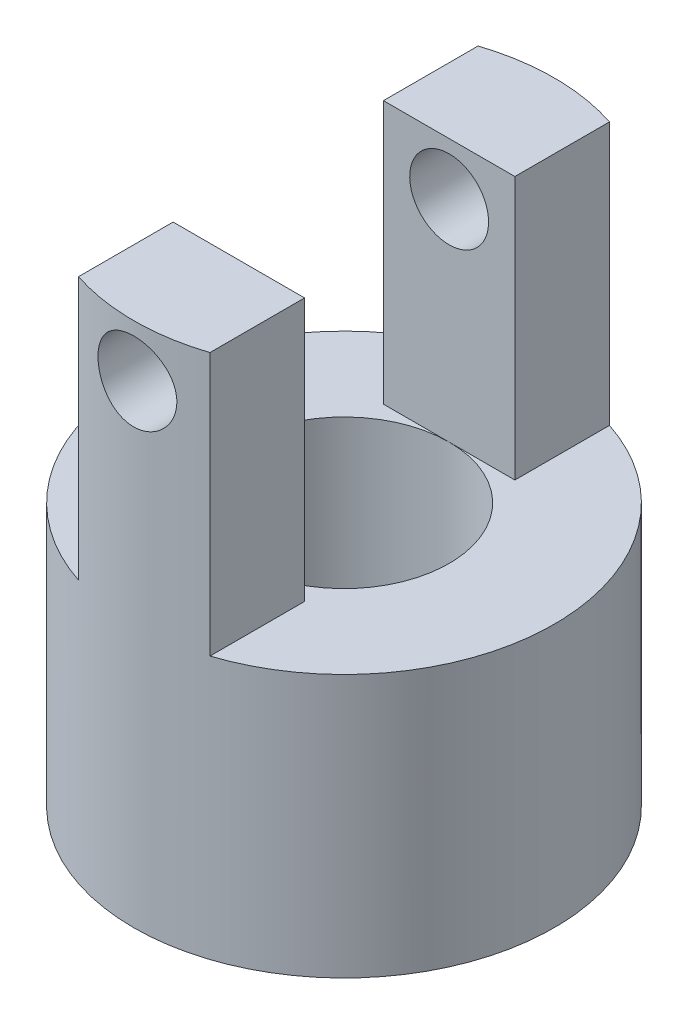
ISO-10303-21;
HEADER;
FILE_DESCRIPTION(('STEP AP214'),'2;1');
FILE_NAME('part.step','',(''),(''),'','','');
FILE_SCHEMA(('AUTOMOTIVE_DESIGN { 1 0 10303 214 1 1 1 1 }'));
ENDSEC;
DATA;
#1=APPLICATION_CONTEXT('core data for automotive mechanical design processes');
#2=APPLICATION_PROTOCOL_DEFINITION('international standard','automotive_design',2000,#1);
#3=PRODUCT_CONTEXT('',#1,'mechanical');
#4=PRODUCT('Part','Part','',(#3));
#5=PRODUCT_RELATED_PRODUCT_CATEGORY('part','',(#4));
#6=PRODUCT_DEFINITION_FORMATION('','',#4);
#7=PRODUCT_DEFINITION_CONTEXT('part definition',#1,'design');
#8=PRODUCT_DEFINITION('design','',#6,#7);
#9=PRODUCT_DEFINITION_SHAPE('','',#8);
#10=(LENGTH_UNIT() NAMED_UNIT(*) SI_UNIT(.MILLI.,.METRE.));
#11=(NAMED_UNIT(*) PLANE_ANGLE_UNIT() SI_UNIT($,.RADIAN.));
#12=(NAMED_UNIT(*) SI_UNIT($,.STERADIAN.) SOLID_ANGLE_UNIT());
#13=UNCERTAINTY_MEASURE_WITH_UNIT(LENGTH_MEASURE(1.E-05),#10,'distance_accuracy_value','');
#14=(GEOMETRIC_REPRESENTATION_CONTEXT(3) GLOBAL_UNCERTAINTY_ASSIGNED_CONTEXT((#13)) GLOBAL_UNIT_ASSIGNED_CONTEXT((#10,
#11,#12)) REPRESENTATION_CONTEXT('',''));
#15=CARTESIAN_POINT('',(0.,0.,0.));
#16=DIRECTION('',(0.,0.,1.));
#17=DIRECTION('',(1.,0.,0.));
#18=AXIS2_PLACEMENT_3D('',#15,#16,#17);
#19=CARTESIAN_POINT('',(-8.,10.,-8.));
#20=DIRECTION('',(0.,-1.,0.));
#21=DIRECTION('',(1.,0.,0.));
#22=AXIS2_PLACEMENT_3D('',#19,#20,#21);
#23=PLANE('',#22);
#24=DIRECTION('',(-1.,0.,0.));
#25=VECTOR('',#24,1.);
#26=CARTESIAN_POINT('',(8.,10.,4.));
#27=LINE('',#26,#25);
#28=CARTESIAN_POINT('',(0.,10.,4.));
#29=VERTEX_POINT('',#28);
#30=CARTESIAN_POINT('',(-2.5,10.,4.));
#31=VERTEX_POINT('',#30);
#32=EDGE_CURVE('E116',#29,#31,#27,.T.);
#33=ORIENTED_EDGE('',*,*,#32,.F.);
#34=CARTESIAN_POINT('',(0.,10.,0.));
#35=DIRECTION('',(0.,-1.,0.));
#36=DIRECTION('',(1.,0.,0.));
#37=AXIS2_PLACEMENT_3D('',#34,#35,#36);
#38=CIRCLE('',#37,4.);
#39=CARTESIAN_POINT('',(0.,10.,-4.));
#40=VERTEX_POINT('',#39);
#41=EDGE_CURVE('E52',#29,#40,#38,.T.);
#42=ORIENTED_EDGE('',*,*,#41,.T.);
#43=DIRECTION('',(-1.,0.,0.));
#44=VECTOR('',#43,1.);
#45=CARTESIAN_POINT('',(8.,10.,-4.));
#46=LINE('',#45,#44);
#47=CARTESIAN_POINT('',(-2.5,10.,-4.));
#48=VERTEX_POINT('',#47);
#49=EDGE_CURVE('E59',#40,#48,#46,.T.);
#50=ORIENTED_EDGE('',*,*,#49,.T.);
#51=DIRECTION('',(0.,0.,1.));
#52=VECTOR('',#51,1.);
#53=CARTESIAN_POINT('',(-2.5,10.,-8.));
#54=LINE('',#53,#52);
#55=CARTESIAN_POINT('',(-2.5,10.,-7.59934207678533));
#56=VERTEX_POINT('',#55);
#57=EDGE_CURVE('E142',#56,#48,#54,.T.);
#58=ORIENTED_EDGE('',*,*,#57,.F.);
#59=CARTESIAN_POINT('',(0.,10.,0.));
#60=DIRECTION('',(0.,-1.,0.));
#61=DIRECTION('',(1.,0.,0.));
#62=AXIS2_PLACEMENT_3D('',#59,#60,#61);
#63=CIRCLE('',#62,8.);
#64=CARTESIAN_POINT('',(-2.5,10.,7.59934207678533));
#65=VERTEX_POINT('',#64);
#66=EDGE_CURVE('E11',#65,#56,#63,.T.);
#67=ORIENTED_EDGE('',*,*,#66,.F.);
#68=EDGE_CURVE('E145',#31,#65,#54,.T.);
#69=ORIENTED_EDGE('',*,*,#68,.F.);
#70=EDGE_LOOP('',(#33,#42,#50,#58,#67,#69));
#71=FACE_BOUND('',#70,.T.);
#72=ADVANCED_FACE('F36',(#71),#23,.F.);
#73=CARTESIAN_POINT('',(0.,20.,0.));
#74=DIRECTION('',(0.,1.,0.));
#75=DIRECTION('',(0.,0.,1.));
#76=AXIS2_PLACEMENT_3D('',#73,#74,#75);
#77=PLANE('',#76);
#78=DIRECTION('',(-1.,0.,0.));
#79=VECTOR('',#78,1.);
#80=CARTESIAN_POINT('',(8.,20.,-4.));
#81=LINE('',#80,#79);
#82=CARTESIAN_POINT('',(2.5,20.,-4.));
#83=VERTEX_POINT('',#82);
#84=CARTESIAN_POINT('',(-2.5,20.,-4.));
#85=VERTEX_POINT('',#84);
#86=EDGE_CURVE('E139',#83,#85,#81,.T.);
#87=ORIENTED_EDGE('',*,*,#86,.F.);
#88=DIRECTION('',(0.,0.,1.));
#89=VECTOR('',#88,1.);
#90=CARTESIAN_POINT('',(2.5,20.,0.));
#91=LINE('',#90,#89);
#92=CARTESIAN_POINT('',(2.5,20.,-7.59934207678533));
#93=VERTEX_POINT('',#92);
#94=EDGE_CURVE('E165',#93,#83,#91,.T.);
#95=ORIENTED_EDGE('',*,*,#94,.F.);
#96=CARTESIAN_POINT('',(0.,20.,0.));
#97=DIRECTION('',(0.,1.,0.));
#98=DIRECTION('',(0.,0.,1.));
#99=AXIS2_PLACEMENT_3D('',#96,#97,#98);
#100=CIRCLE('',#99,8.);
#101=CARTESIAN_POINT('',(-2.5,20.,-7.59934207678533));
#102=VERTEX_POINT('',#101);
#103=EDGE_CURVE('E162',#93,#102,#100,.T.);
#104=ORIENTED_EDGE('',*,*,#103,.T.);
#105=DIRECTION('',(0.,0.,-1.));
#106=VECTOR('',#105,1.);
#107=CARTESIAN_POINT('',(-2.5,20.,0.));
#108=LINE('',#107,#106);
#109=EDGE_CURVE('E168',#85,#102,#108,.T.);
#110=ORIENTED_EDGE('',*,*,#109,.F.);
#111=EDGE_LOOP('',(#87,#95,#104,#110));
#112=FACE_BOUND('',#111,.T.);
#113=ADVANCED_FACE('F189',(#112),#77,.T.);
#114=CARTESIAN_POINT('',(2.5,20.,-8.));
#115=DIRECTION('',(-1.,0.,0.));
#116=DIRECTION('',(0.,-1.,0.));
#117=AXIS2_PLACEMENT_3D('',#114,#115,#116);
#118=PLANE('',#117);
#119=ORIENTED_EDGE('',*,*,#94,.T.);
#120=DIRECTION('',(0.,-1.,0.));
#121=VECTOR('',#120,1.);
#122=CARTESIAN_POINT('',(2.5,20.,-4.));
#123=LINE('',#122,#121);
#124=CARTESIAN_POINT('',(2.5,10.,-4.));
#125=VERTEX_POINT('',#124);
#126=EDGE_CURVE('E138',#83,#125,#123,.T.);
#127=ORIENTED_EDGE('',*,*,#126,.T.);
#128=DIRECTION('',(0.,0.,1.));
#129=VECTOR('',#128,1.);
#130=CARTESIAN_POINT('',(2.5,10.,-8.));
#131=LINE('',#130,#129);
#132=CARTESIAN_POINT('',(2.5,10.,-7.59934207678533));
#133=VERTEX_POINT('',#132);
#134=EDGE_CURVE('E130',#133,#125,#131,.T.);
#135=ORIENTED_EDGE('',*,*,#134,.F.);
#136=DIRECTION('',(0.,-1.,0.));
#137=VECTOR('',#136,1.);
#138=CARTESIAN_POINT('',(2.5,20.,-7.59934207678533));
#139=LINE('',#138,#137);
#140=EDGE_CURVE('E149',#93,#133,#139,.T.);
#141=ORIENTED_EDGE('',*,*,#140,.F.);
#142=EDGE_LOOP('',(#119,#127,#135,#141));
#143=FACE_BOUND('',#142,.T.);
#144=ADVANCED_FACE('F208',(#143),#118,.F.);
#145=CARTESIAN_POINT('',(-2.5,20.,-8.));
#146=DIRECTION('',(1.,0.,0.));
#147=DIRECTION('',(0.,1.,0.));
#148=AXIS2_PLACEMENT_3D('',#145,#146,#147);
#149=PLANE('',#148);
#150=ORIENTED_EDGE('',*,*,#57,.T.);
#151=DIRECTION('',(0.,-1.,0.));
#152=VECTOR('',#151,1.);
#153=CARTESIAN_POINT('',(-2.5,20.,-4.));
#154=LINE('',#153,#152);
#155=EDGE_CURVE('E123',#85,#48,#154,.T.);
#156=ORIENTED_EDGE('',*,*,#155,.F.);
#157=ORIENTED_EDGE('',*,*,#109,.T.);
#158=DIRECTION('',(0.,-1.,0.));
#159=VECTOR('',#158,1.);
#160=CARTESIAN_POINT('',(-2.5,20.,-7.59934207678533));
#161=LINE('',#160,#159);
#162=EDGE_CURVE('E152',#56,#102,#161,.F.);
#163=ORIENTED_EDGE('',*,*,#162,.F.);
#164=EDGE_LOOP('',(#150,#156,#157,#163));
#165=FACE_BOUND('',#164,.T.);
#166=ADVANCED_FACE('F192',(#165),#149,.F.);
#167=CARTESIAN_POINT('',(0.,20.,0.));
#168=DIRECTION('',(0.,-1.,0.));
#169=DIRECTION('',(0.,0.,-1.));
#170=AXIS2_PLACEMENT_3D('',#167,#168,#169);
#171=CYLINDRICAL_SURFACE('',#170,8.);
#172=CARTESIAN_POINT('',(0.,19.5,-8.));
#173=CARTESIAN_POINT('',(-0.0834717464654709,19.4999968104117,-7.99999848833852));
#174=CARTESIAN_POINT('',(-0.166984992730099,19.4930089233806,-7.99868009921714));
#175=CARTESIAN_POINT('',(-0.331658129841798,19.4652600048817,-7.9935478589052));
#176=CARTESIAN_POINT('',(-0.412815974152226,19.4444873493603,-7.98973190166897));
#177=CARTESIAN_POINT('',(-0.570372961851802,19.3898272987407,-7.98003138765458));
#178=CARTESIAN_POINT('',(-0.646776330685345,19.3559517475475,-7.97414869946483));
#179=CARTESIAN_POINT('',(-0.792807973094008,19.2760811230772,-7.96095710599783));
#180=CARTESIAN_POINT('',(-0.862436794477324,19.2300870308552,-7.9536483161829));
#181=CARTESIAN_POINT('',(-0.993783715930504,19.1267002319963,-7.93831336430504));
#182=CARTESIAN_POINT('',(-1.05540895503183,19.0691905553299,-7.93028034856351));
#183=CARTESIAN_POINT('',(-1.16819606135369,18.9446566909124,-7.9144531845865));
#184=CARTESIAN_POINT('',(-1.21935717689242,18.8776318202307,-7.90665905354527));
#185=CARTESIAN_POINT('',(-1.31014998665793,18.735313911636,-7.89212551245005));
#186=CARTESIAN_POINT('',(-1.34968721969605,18.6599596296828,-7.88539493886182));
#187=CARTESIAN_POINT('',(-1.41550524332283,18.5035310848232,-7.87384713211987));
#188=CARTESIAN_POINT('',(-1.44178717713098,18.4224573158888,-7.86902973396962));
#189=CARTESIAN_POINT('',(-1.480050535035,18.2578847690856,-7.8619226957455));
#190=CARTESIAN_POINT('',(-1.49219390192039,18.1744249027965,-7.85960445366405));
#191=CARTESIAN_POINT('',(-1.50233808095346,18.0066226151918,-7.85767197152761));
#192=CARTESIAN_POINT('',(-1.50034016135374,17.9222802736977,-7.8580574889876));
#193=CARTESIAN_POINT('',(-1.48238979602362,17.7562804747339,-7.86146292701753));
#194=CARTESIAN_POINT('',(-1.46662149996045,17.6746022856998,-7.86444808147334));
#195=CARTESIAN_POINT('',(-1.42186799396207,17.5150715802174,-7.87266183284666));
#196=CARTESIAN_POINT('',(-1.39288222239499,17.4372192264907,-7.87789052509516));
#197=CARTESIAN_POINT('',(-1.322336471793,17.2870113209997,-7.89003855292588));
#198=CARTESIAN_POINT('',(-1.28070213532456,17.2146915294192,-7.89696783823366));
#199=CARTESIAN_POINT('',(-1.18609368930416,17.0779952714598,-7.91172971602918));
#200=CARTESIAN_POINT('',(-1.13311842889266,17.0136196122852,-7.91956240015522));
#201=CARTESIAN_POINT('',(-1.01633905685298,16.8935750443275,-7.93540001272164));
#202=CARTESIAN_POINT('',(-0.952377436860681,16.8380593475483,-7.94340571024031));
#203=CARTESIAN_POINT('',(-0.815968037098825,16.7385227593246,-7.95857386108318));
#204=CARTESIAN_POINT('',(-0.743520172255767,16.6945019831296,-7.96573630595245));
#205=CARTESIAN_POINT('',(-0.592034988874666,16.61918224613,-7.97842539677509));
#206=CARTESIAN_POINT('',(-0.512989564446492,16.5878992208821,-7.98394999136289));
#207=CARTESIAN_POINT('',(-0.350639115398696,16.5390979069078,-7.99272505402719));
#208=CARTESIAN_POINT('',(-0.267334544277786,16.5215781559546,-7.99597576367994));
#209=CARTESIAN_POINT('',(-0.100148652903384,16.5010139689817,-7.99980360641981));
#210=CARTESIAN_POINT('',(-0.0162940126341339,16.4977596084703,-8.00041950912279));
#211=CARTESIAN_POINT('',(0.150761248092186,16.5052554795476,-7.99901543598228));
#212=CARTESIAN_POINT('',(0.233961900480387,16.5160050230653,-7.99699558964431));
#213=CARTESIAN_POINT('',(0.396681573218219,16.5510290351834,-7.99057111500406));
#214=CARTESIAN_POINT('',(0.476224261046065,16.5751972825378,-7.98618522374031));
#215=CARTESIAN_POINT('',(0.630128631824635,16.6362577067788,-7.97551842212498));
#216=CARTESIAN_POINT('',(0.704489962595104,16.6731507475658,-7.96923738311334));
#217=CARTESIAN_POINT('',(0.846816671513216,16.7590781281595,-7.95538030357666));
#218=CARTESIAN_POINT('',(0.914703277015123,16.8082407385368,-7.94779086174563));
#219=CARTESIAN_POINT('',(1.04133832326455,16.9171381373624,-7.93219343489711));
#220=CARTESIAN_POINT('',(1.10008590976087,16.9768739130013,-7.92418541084687));
#221=CARTESIAN_POINT('',(1.20757295872048,17.1061723189114,-7.9085247569745));
#222=CARTESIAN_POINT('',(1.25616916218577,17.1758549081254,-7.90087825860257));
#223=CARTESIAN_POINT('',(1.34096675057787,17.3225176245238,-7.88692985578532));
#224=CARTESIAN_POINT('',(1.37716859613924,17.3994974803705,-7.8806279013735));
#225=CARTESIAN_POINT('',(1.43594673512823,17.5582058672425,-7.87013024209574));
#226=CARTESIAN_POINT('',(1.45858868794786,17.6399093795593,-7.86592440436878));
#227=CARTESIAN_POINT('',(1.48980679326236,17.8060472225214,-7.86007203802415));
#228=CARTESIAN_POINT('',(1.49838453270708,17.8904812439704,-7.8584252206579));
#229=CARTESIAN_POINT('',(1.50117762148355,18.0582483314415,-7.85789199803857));
#230=CARTESIAN_POINT('',(1.49561895003499,18.141577580957,-7.85896215974293));
#231=CARTESIAN_POINT('',(1.47079175378803,18.3060914220453,-7.86364600659998));
#232=CARTESIAN_POINT('',(1.45152331089332,18.3872760264274,-7.86725967655747));
#233=CARTESIAN_POINT('',(1.39991887583263,18.5450744847955,-7.8766050802318));
#234=CARTESIAN_POINT('',(1.36760735397252,18.6216965913458,-7.88233284594965));
#235=CARTESIAN_POINT('',(1.29085868912204,18.7684682542408,-7.8952638755184));
#236=CARTESIAN_POINT('',(1.24642068948186,18.8386173528448,-7.90246724360119));
#237=CARTESIAN_POINT('',(1.14589487339535,18.9715836800423,-7.91767266107745));
#238=CARTESIAN_POINT('',(1.08964259864303,19.0342754125671,-7.92568505353043));
#239=CARTESIAN_POINT('',(0.967427926742289,19.1494051624645,-7.94152833918735));
#240=CARTESIAN_POINT('',(0.901463301891614,19.2018408209801,-7.94935919027328));
#241=CARTESIAN_POINT('',(0.760984945071871,19.2954109526271,-7.96403975968049));
#242=CARTESIAN_POINT('',(0.686399590640515,19.3364394284906,-7.97088000990561));
#243=CARTESIAN_POINT('',(0.531290113653832,19.4053176366051,-7.98271619380687));
#244=CARTESIAN_POINT('',(0.450771651705246,19.4331797470469,-7.98771385879037));
#245=CARTESIAN_POINT('',(0.308347202825152,19.4692773144187,-7.99428290707632));
#246=CARTESIAN_POINT('',(0.24727381025187,19.4807786303128,-7.99641470878206));
#247=CARTESIAN_POINT('',(0.124141247115157,19.4961410621164,-7.9992737995401));
#248=CARTESIAN_POINT('',(0.0620821016527092,19.5000023722559,-8.00000112429805));
#249=CARTESIAN_POINT('',(0.,19.5,-8.));
#250=B_SPLINE_CURVE_WITH_KNOTS('',3,(#172,#173,#174,#175,#176,#177,#178,#179,#180,#181,#182,
#183,#184,#185,#186,#187,#188,#189,#190,#191,#192,#193,#194,#195,#196,#197,#198,#199,#200,#201,
#202,#203,#204,#205,#206,#207,#208,#209,#210,#211,#212,#213,#214,#215,#216,#217,#218,#219,#220,
#221,#222,#223,#224,#225,#226,#227,#228,#229,#230,#231,#232,#233,#234,#235,#236,#237,#238,#239,
#240,#241,#242,#243,#244,#245,#246,#247,#248,#249),.UNSPECIFIED.,.T.,.F.,(4,2,2,2,2,2,2,2,2,2,2,
2,2,2,2,2,2,2,2,2,2,2,2,2,2,2,2,2,2,2,2,2,2,2,2,2,2,2,4),(0.,0.250188200964924,
0.500587642535453,0.750761271230908,1.00091465336891,1.25375118013631,1.50660586283617,
1.76146190504358,2.01629596311949,2.26818151445336,2.52004447587256,2.76859000612766,
3.01714609846787,3.26719262629531,3.5172645404986,3.77127768464077,4.02529337544948,
4.27962588321699,4.53393136673746,4.78448174076097,5.03501980464584,5.28360233907829,
5.53220175338032,5.78351778017709,6.03485728413099,6.289534369873,6.54420198954946,
6.7976262781856,7.05102196946513,7.30039252231749,7.54976158541507,7.79866496207693,
8.04758592655424,8.30023369966381,8.55293951262256,8.80792048916315,9.06266126931174,
9.2487434452441,9.43482089039541),.UNSPECIFIED.);
#251=CARTESIAN_POINT('',(0.,19.5,-8.));
#252=VERTEX_POINT('',#251);
#253=EDGE_CURVE('E203',#252,#252,#250,.T.);
#254=ORIENTED_EDGE('',*,*,#253,.T.);
#255=EDGE_LOOP('',(#254));
#256=FACE_BOUND('',#255,.T.);
#257=CARTESIAN_POINT('',(1.5,18.,7.85811682275086));
#258=CARTESIAN_POINT('',(1.49999679883246,17.9165427919883,7.85811843793493));
#259=CARTESIAN_POINT('',(1.49301126348936,17.8330440517816,7.85946079760266));
#260=CARTESIAN_POINT('',(1.46527253251805,17.6684010384181,7.86467851014364));
#261=CARTESIAN_POINT('',(1.44450765768477,17.5872588235725,7.86855601173205));
#262=CARTESIAN_POINT('',(1.38987035617788,17.4297349286291,7.87838976464885));
#263=CARTESIAN_POINT('',(1.35601013954374,17.3533488906927,7.88434407905997));
#264=CARTESIAN_POINT('',(1.27617565760366,17.2073464407132,7.89765826320959));
#265=CARTESIAN_POINT('',(1.23020233759193,17.1377295009967,7.90501802325622));
#266=CARTESIAN_POINT('',(1.12683678942623,17.0063698008009,7.92041614838944));
#267=CARTESIAN_POINT('',(1.06932292933092,16.9447235165283,7.92846116625679));
#268=CARTESIAN_POINT('',(0.944771778803554,16.8318956104004,7.94426457664034));
#269=CARTESIAN_POINT('',(0.877733863624947,16.7807146755752,7.95202295031153));
#270=CARTESIAN_POINT('',(0.735403894570165,16.6899006233995,7.96645017828405));
#271=CARTESIAN_POINT('',(0.660052840033868,16.6503584664806,7.97311028052363));
#272=CARTESIAN_POINT('',(0.503631283250764,16.5845304577265,7.9845160863293));
#273=CARTESIAN_POINT('',(0.422561251859507,16.5582435160098,7.98926194728334));
#274=CARTESIAN_POINT('',(0.258002746187416,16.5199704513889,7.99625755123778));
#275=CARTESIAN_POINT('',(0.174553323244857,16.5078216940773,7.99853565976327));
#276=CARTESIAN_POINT('',(0.00677167603538365,16.4976631122996,8.00043684615594));
#277=CARTESIAN_POINT('',(-0.0775604724476695,16.4996520838609,8.00006015010697));
#278=CARTESIAN_POINT('',(-0.243598357899396,16.5175877711471,7.99671633763241));
#279=CARTESIAN_POINT('',(-0.325323760451468,16.53335936943,7.99378172247214));
#280=CARTESIAN_POINT('',(-0.484947165715475,16.5781356493952,7.98568826333561));
#281=CARTESIAN_POINT('',(-0.56284502882654,16.6071408133458,7.98052933829966));
#282=CARTESIAN_POINT('',(-0.713110065751521,16.6777277310583,7.96851260297339));
#283=CARTESIAN_POINT('',(-0.785443571838532,16.7193794879125,7.96164537590825));
#284=CARTESIAN_POINT('',(-0.922159977214636,16.8140256690772,7.9469714754285));
#285=CARTESIAN_POINT('',(-0.986542066910784,16.8670212468876,7.93916470651164));
#286=CARTESIAN_POINT('',(-1.10656561896904,16.9838157029835,7.92333513680567));
#287=CARTESIAN_POINT('',(-1.16205790757041,17.0477677839021,7.91531085901621));
#288=CARTESIAN_POINT('',(-1.26155171851261,17.1841495312786,7.9000650892462));
#289=CARTESIAN_POINT('',(-1.30555307271182,17.2565793217646,7.89284360901351));
#290=CARTESIAN_POINT('',(-1.38085852224478,17.4080582707027,7.88001893307121));
#291=CARTESIAN_POINT('',(-1.41214093645421,17.4871184571906,7.87441850530261));
#292=CARTESIAN_POINT('',(-1.46093656975056,17.6495011841232,7.86551242396689));
#293=CARTESIAN_POINT('',(-1.47845134901108,17.7328232404648,7.8622065103862));
#294=CARTESIAN_POINT('',(-1.49899672649739,17.9000193288559,7.85831520301005));
#295=CARTESIAN_POINT('',(-1.50224164285859,17.9838661155655,7.85768955816136));
#296=CARTESIAN_POINT('',(-1.49472968881725,18.1509034550871,7.8591219142084));
#297=CARTESIAN_POINT('',(-1.48397351086433,18.2340940401481,7.86117978238611));
#298=CARTESIAN_POINT('',(-1.44894868195883,18.3967529030544,7.86770980063205));
#299=CARTESIAN_POINT('',(-1.4247923858399,18.4762462526249,7.87216186690878));
#300=CARTESIAN_POINT('',(-1.3637722437906,18.6300571897302,7.88296134156618));
#301=CARTESIAN_POINT('',(-1.32690746128795,18.7043743953153,7.88930888963281));
#302=CARTESIAN_POINT('',(-1.2410235311966,18.8466676190432,7.90327577863685));
#303=CARTESIAN_POINT('',(-1.19186899639621,18.9145605378661,7.91090895425315));
#304=CARTESIAN_POINT('',(-1.08298344344247,19.0412120402143,7.926548113681));
#305=CARTESIAN_POINT('',(-1.02325147433084,19.0999698015558,7.93455413096494));
#306=CARTESIAN_POINT('',(-0.893949417870387,19.2074837635341,7.95016624005946));
#307=CARTESIAN_POINT('',(-0.824258534095891,19.256095826606,7.95776555833305));
#308=CARTESIAN_POINT('',(-0.677574523040141,19.3409212061777,7.97159404810351));
#309=CARTESIAN_POINT('',(-0.60058167703853,19.377135000025,7.97782327234725));
#310=CARTESIAN_POINT('',(-0.441877541578686,19.4359200978641,7.98818057995848));
#311=CARTESIAN_POINT('',(-0.36019321307899,19.4585621875614,7.99231954730142));
#312=CARTESIAN_POINT('',(-0.194096227381572,19.4897870482899,7.99807642083745));
#313=CARTESIAN_POINT('',(-0.109683858215852,19.4983712986627,7.99969459229933));
#314=CARTESIAN_POINT('',(0.0580907602505086,19.5011853015184,8.00022227515441));
#315=CARTESIAN_POINT('',(0.141449307066268,19.4956327531295,7.99917286625032));
#316=CARTESIAN_POINT('',(0.306023369279199,19.4708075722316,7.99456866611703));
#317=CARTESIAN_POINT('',(0.387238905213689,19.4515350712558,7.99101389890671));
#318=CARTESIAN_POINT('',(0.545106475595484,19.3999087926163,7.98179837978045));
#319=CARTESIAN_POINT('',(0.621766319318222,19.367578187119,7.97614135981576));
#320=CARTESIAN_POINT('',(0.768605631316693,19.2907795463448,7.96333372068771));
#321=CARTESIAN_POINT('',(0.838784665003271,19.2463106978933,7.95618300146483));
#322=CARTESIAN_POINT('',(0.971755027780006,19.1457485455577,7.94104779859941));
#323=CARTESIAN_POINT('',(1.03442623539053,19.0894979661383,7.93305284591272));
#324=CARTESIAN_POINT('',(1.14951536065485,18.9672954375073,7.91719633538833));
#325=CARTESIAN_POINT('',(1.2019308632478,18.9013412096263,7.90933480936765));
#326=CARTESIAN_POINT('',(1.29547633945385,18.7608735452967,7.89455577425926));
#327=CARTESIAN_POINT('',(1.33649740531872,18.6862865603324,7.88764767280729));
#328=CARTESIAN_POINT('',(1.40536132423417,18.5311742100203,7.87567084650033));
#329=CARTESIAN_POINT('',(1.43321661638912,18.4506545334106,7.87060038649116));
#330=CARTESIAN_POINT('',(1.46929726596175,18.3082477119341,7.86393016292125));
#331=CARTESIAN_POINT('',(1.48079105739851,18.2471942762381,7.86176310717932));
#332=CARTESIAN_POINT('',(1.49614351076215,18.1241015315797,7.85885585595504));
#333=CARTESIAN_POINT('',(1.50000238052127,18.0620622494997,7.85811562163283));
#334=CARTESIAN_POINT('',(1.5,18.,7.85811682275086));
#335=B_SPLINE_CURVE_WITH_KNOTS('',3,(#257,#258,#259,#260,#261,#262,#263,#264,#265,#266,#267,
#268,#269,#270,#271,#272,#273,#274,#275,#276,#277,#278,#279,#280,#281,#282,#283,#284,#285,#286,
#287,#288,#289,#290,#291,#292,#293,#294,#295,#296,#297,#298,#299,#300,#301,#302,#303,#304,#305,
#306,#307,#308,#309,#310,#311,#312,#313,#314,#315,#316,#317,#318,#319,#320,#321,#322,#323,#324,
#325,#326,#327,#328,#329,#330,#331,#332,#333,#334),.UNSPECIFIED.,.T.,.F.,(4,2,2,2,2,2,2,2,2,2,2,
2,2,2,2,2,2,2,2,2,2,2,2,2,2,2,2,2,2,2,2,2,2,2,2,2,2,2,4),(0.,0.250144505793185,
0.500501302380392,0.750625227978431,1.00072963993908,1.25362335698691,1.50653367069315,
1.76137104348047,2.0161874593964,2.26804275460261,2.51987660200648,2.76855650598725,
3.01724547328425,3.26733691984219,3.51745380911785,3.77140614764064,4.025362201924,
4.27974936118267,4.53410768866488,4.78463248587075,5.03514489338719,5.28358792315369,
5.53204926624318,5.78337862654144,6.03473059394677,6.28944125495872,6.54414210821706,
6.79750269418684,7.05083661667331,7.30029300570139,7.54974700322168,7.79876026530358,
8.0477902135711,8.30038464008745,8.55303847730765,8.80803001818118,9.0627801574912,
9.24880307527216,9.43482092920426),.UNSPECIFIED.);
#336=CARTESIAN_POINT('',(1.5,18.,7.85811682275086));
#337=VERTEX_POINT('',#336);
#338=EDGE_CURVE('E244',#337,#337,#335,.T.);
#339=ORIENTED_EDGE('',*,*,#338,.T.);
#340=EDGE_LOOP('',(#339));
#341=FACE_BOUND('',#340,.T.);
#342=CARTESIAN_POINT('',(-2.5,20.,7.59934207678533));
#343=VERTEX_POINT('',#342);
#344=CARTESIAN_POINT('',(2.5,20.,7.59934207678533));
#345=VERTEX_POINT('',#344);
#346=EDGE_CURVE('E159',#343,#345,#100,.T.);
#347=ORIENTED_EDGE('',*,*,#346,.F.);
#348=DIRECTION('',(0.,-1.,0.));
#349=VECTOR('',#348,1.);
#350=CARTESIAN_POINT('',(-2.5,20.,7.59934207678533));
#351=LINE('',#350,#349);
#352=EDGE_CURVE('E155',#343,#65,#351,.T.);
#353=ORIENTED_EDGE('',*,*,#352,.T.);
#354=ORIENTED_EDGE('',*,*,#66,.T.);
#355=ORIENTED_EDGE('',*,*,#162,.T.);
#356=ORIENTED_EDGE('',*,*,#103,.F.);
#357=ORIENTED_EDGE('',*,*,#140,.T.);
#358=CARTESIAN_POINT('',(0.,10.,0.));
#359=DIRECTION('',(0.,-1.,0.));
#360=DIRECTION('',(0.,0.,-1.));
#361=AXIS2_PLACEMENT_3D('',#358,#359,#360);
#362=CIRCLE('',#361,8.);
#363=CARTESIAN_POINT('',(2.5,10.,7.59934207678533));
#364=VERTEX_POINT('',#363);
#365=EDGE_CURVE('E46',#133,#364,#362,.T.);
#366=ORIENTED_EDGE('',*,*,#365,.T.);
#367=DIRECTION('',(0.,-1.,0.));
#368=VECTOR('',#367,1.);
#369=CARTESIAN_POINT('',(2.5,20.,7.59934207678533));
#370=LINE('',#369,#368);
#371=EDGE_CURVE('E144',#364,#345,#370,.F.);
#372=ORIENTED_EDGE('',*,*,#371,.T.);
#373=EDGE_LOOP('',(#347,#353,#354,#355,#356,#357,#366,#372));
#374=FACE_BOUND('',#373,.T.);
#375=CARTESIAN_POINT('',(0.,0.,0.));
#376=DIRECTION('',(0.,1.,0.));
#377=DIRECTION('',(0.,0.,1.));
#378=AXIS2_PLACEMENT_3D('',#375,#376,#377);
#379=CIRCLE('',#378,8.);
#380=CARTESIAN_POINT('',(0.,0.,8.));
#381=VERTEX_POINT('',#380);
#382=EDGE_CURVE('E158',#381,#381,#379,.T.);
#383=ORIENTED_EDGE('',*,*,#382,.T.);
#384=EDGE_LOOP('',(#383));
#385=FACE_BOUND('',#384,.T.);
#386=ADVANCED_FACE('F38',(#256,#341,#374,#385),#171,.T.);
#387=DIRECTION('',(-1.,0.,0.));
#388=VECTOR('',#387,1.);
#389=CARTESIAN_POINT('',(8.,20.,4.));
#390=LINE('',#389,#388);
#391=CARTESIAN_POINT('',(2.5,20.,4.));
#392=VERTEX_POINT('',#391);
#393=CARTESIAN_POINT('',(-2.5,20.,4.));
#394=VERTEX_POINT('',#393);
#395=EDGE_CURVE('E198',#392,#394,#390,.T.);
#396=ORIENTED_EDGE('',*,*,#395,.T.);
#397=EDGE_CURVE('E170',#343,#394,#108,.T.);
#398=ORIENTED_EDGE('',*,*,#397,.F.);
#399=ORIENTED_EDGE('',*,*,#346,.T.);
#400=EDGE_CURVE('E169',#392,#345,#91,.T.);
#401=ORIENTED_EDGE('',*,*,#400,.F.);
#402=EDGE_LOOP('',(#396,#398,#399,#401));
#403=FACE_BOUND('',#402,.T.);
#404=ADVANCED_FACE('F197',(#403),#77,.T.);
#405=CARTESIAN_POINT('',(0.,0.,0.));
#406=DIRECTION('',(0.,1.,0.));
#407=DIRECTION('',(0.,0.,1.));
#408=AXIS2_PLACEMENT_3D('',#405,#406,#407);
#409=PLANE('',#408);
#410=CARTESIAN_POINT('',(0.,0.,0.));
#411=DIRECTION('',(0.,-1.,0.));
#412=DIRECTION('',(0.,0.,-1.));
#413=AXIS2_PLACEMENT_3D('',#410,#411,#412);
#414=CIRCLE('',#413,4.);
#415=CARTESIAN_POINT('',(0.,0.,-4.));
#416=VERTEX_POINT('',#415);
#417=EDGE_CURVE('E113',#416,#416,#414,.T.);
#418=ORIENTED_EDGE('',*,*,#417,.F.);
#419=EDGE_LOOP('',(#418));
#420=FACE_BOUND('',#419,.T.);
#421=ORIENTED_EDGE('',*,*,#382,.F.);
#422=EDGE_LOOP('',(#421));
#423=FACE_BOUND('',#422,.T.);
#424=ADVANCED_FACE('F219',(#420,#423),#409,.F.);
#425=CARTESIAN_POINT('',(2.5,10.,4.));
#426=VERTEX_POINT('',#425);
#427=EDGE_CURVE('E141',#426,#364,#131,.T.);
#428=ORIENTED_EDGE('',*,*,#427,.F.);
#429=DIRECTION('',(0.,1.,0.));
#430=VECTOR('',#429,1.);
#431=CARTESIAN_POINT('',(2.5,20.,4.));
#432=LINE('',#431,#430);
#433=EDGE_CURVE('E135',#426,#392,#432,.T.);
#434=ORIENTED_EDGE('',*,*,#433,.T.);
#435=ORIENTED_EDGE('',*,*,#400,.T.);
#436=ORIENTED_EDGE('',*,*,#371,.F.);
#437=EDGE_LOOP('',(#428,#434,#435,#436));
#438=FACE_BOUND('',#437,.T.);
#439=ADVANCED_FACE('F181',(#438),#118,.F.);
#440=EDGE_CURVE('E120',#125,#40,#46,.T.);
#441=ORIENTED_EDGE('',*,*,#440,.T.);
#442=EDGE_CURVE('E107',#40,#29,#38,.T.);
#443=ORIENTED_EDGE('',*,*,#442,.T.);
#444=EDGE_CURVE('E131',#426,#29,#27,.T.);
#445=ORIENTED_EDGE('',*,*,#444,.F.);
#446=ORIENTED_EDGE('',*,*,#427,.T.);
#447=ORIENTED_EDGE('',*,*,#365,.F.);
#448=ORIENTED_EDGE('',*,*,#134,.T.);
#449=EDGE_LOOP('',(#441,#443,#445,#446,#447,#448));
#450=FACE_BOUND('',#449,.T.);
#451=ADVANCED_FACE('F128',(#450),#23,.F.);
#452=ORIENTED_EDGE('',*,*,#397,.T.);
#453=DIRECTION('',(0.,1.,0.));
#454=VECTOR('',#453,1.);
#455=CARTESIAN_POINT('',(-2.5,20.,4.));
#456=LINE('',#455,#454);
#457=EDGE_CURVE('E125',#31,#394,#456,.T.);
#458=ORIENTED_EDGE('',*,*,#457,.F.);
#459=ORIENTED_EDGE('',*,*,#68,.T.);
#460=ORIENTED_EDGE('',*,*,#352,.F.);
#461=EDGE_LOOP('',(#452,#458,#459,#460));
#462=FACE_BOUND('',#461,.T.);
#463=ADVANCED_FACE('F195',(#462),#149,.F.);
#464=CARTESIAN_POINT('',(8.,20.,-4.));
#465=DIRECTION('',(0.,0.,-1.));
#466=DIRECTION('',(0.,1.,0.));
#467=AXIS2_PLACEMENT_3D('',#464,#465,#466);
#468=PLANE('',#467);
#469=CARTESIAN_POINT('',(0.,18.,-4.));
#470=DIRECTION('',(0.,0.,-1.));
#471=DIRECTION('',(0.,1.,0.));
#472=AXIS2_PLACEMENT_3D('',#469,#470,#471);
#473=CIRCLE('',#472,1.5);
#474=CARTESIAN_POINT('',(0.,19.5,-4.));
#475=VERTEX_POINT('',#474);
#476=EDGE_CURVE('E256',#475,#475,#473,.T.);
#477=ORIENTED_EDGE('',*,*,#476,.T.);
#478=EDGE_LOOP('',(#477));
#479=FACE_BOUND('',#478,.T.);
#480=ORIENTED_EDGE('',*,*,#86,.T.);
#481=ORIENTED_EDGE('',*,*,#155,.T.);
#482=ORIENTED_EDGE('',*,*,#49,.F.);
#483=ORIENTED_EDGE('',*,*,#440,.F.);
#484=ORIENTED_EDGE('',*,*,#126,.F.);
#485=EDGE_LOOP('',(#480,#481,#482,#483,#484));
#486=FACE_BOUND('',#485,.T.);
#487=ADVANCED_FACE('F119',(#479,#486),#468,.F.);
#488=CARTESIAN_POINT('',(8.,20.,4.));
#489=DIRECTION('',(0.,0.,1.));
#490=DIRECTION('',(0.,-1.,0.));
#491=AXIS2_PLACEMENT_3D('',#488,#489,#490);
#492=PLANE('',#491);
#493=CARTESIAN_POINT('',(0.,18.,4.));
#494=DIRECTION('',(0.,0.,1.));
#495=DIRECTION('',(0.,-1.,0.));
#496=AXIS2_PLACEMENT_3D('',#493,#494,#495);
#497=CIRCLE('',#496,1.5);
#498=CARTESIAN_POINT('',(0.,16.5,4.));
#499=VERTEX_POINT('',#498);
#500=EDGE_CURVE('E41',#499,#499,#497,.T.);
#501=ORIENTED_EDGE('',*,*,#500,.T.);
#502=EDGE_LOOP('',(#501));
#503=FACE_BOUND('',#502,.T.);
#504=ORIENTED_EDGE('',*,*,#457,.T.);
#505=ORIENTED_EDGE('',*,*,#395,.F.);
#506=ORIENTED_EDGE('',*,*,#433,.F.);
#507=ORIENTED_EDGE('',*,*,#444,.T.);
#508=ORIENTED_EDGE('',*,*,#32,.T.);
#509=EDGE_LOOP('',(#504,#505,#506,#507,#508));
#510=FACE_BOUND('',#509,.T.);
#511=ADVANCED_FACE('F201',(#503,#510),#492,.F.);
#512=CARTESIAN_POINT('',(0.,18.,-8.));
#513=DIRECTION('',(0.,0.,1.));
#514=DIRECTION('',(1.,0.,0.));
#515=AXIS2_PLACEMENT_3D('',#512,#513,#514);
#516=CYLINDRICAL_SURFACE('',#515,1.5);
#517=ORIENTED_EDGE('',*,*,#500,.F.);
#518=EDGE_LOOP('',(#517));
#519=FACE_BOUND('',#518,.T.);
#520=ORIENTED_EDGE('',*,*,#338,.F.);
#521=EDGE_LOOP('',(#520));
#522=FACE_BOUND('',#521,.T.);
#523=ADVANCED_FACE('F235',(#519,#522),#516,.F.);
#524=ORIENTED_EDGE('',*,*,#476,.F.);
#525=EDGE_LOOP('',(#524));
#526=FACE_BOUND('',#525,.T.);
#527=ORIENTED_EDGE('',*,*,#253,.F.);
#528=EDGE_LOOP('',(#527));
#529=FACE_BOUND('',#528,.T.);
#530=ADVANCED_FACE('F237',(#526,#529),#516,.F.);
#531=CARTESIAN_POINT('',(0.,20.,0.));
#532=DIRECTION('',(0.,-1.,0.));
#533=DIRECTION('',(0.,0.,-1.));
#534=AXIS2_PLACEMENT_3D('',#531,#532,#533);
#535=CYLINDRICAL_SURFACE('',#534,4.);
#536=ORIENTED_EDGE('',*,*,#417,.T.);
#537=EDGE_LOOP('',(#536));
#538=FACE_BOUND('',#537,.T.);
#539=ORIENTED_EDGE('',*,*,#442,.F.);
#540=ORIENTED_EDGE('',*,*,#41,.F.);
#541=EDGE_LOOP('',(#539,#540));
#542=FACE_BOUND('',#541,.T.);
#543=ADVANCED_FACE('F108',(#538,#542),#535,.F.);
#544=CLOSED_SHELL('',(#72,#113,#144,#166,#386,#404,#424,#439,#451,#463,#487,#511,#523,#530,#543));
#545=MANIFOLD_SOLID_BREP('B2',#544);
#546=ADVANCED_BREP_SHAPE_REPRESENTATION('',(#18,#545),#14);
#547=SHAPE_DEFINITION_REPRESENTATION(#9,#546);
ENDSEC;
END-ISO-10303-21;
